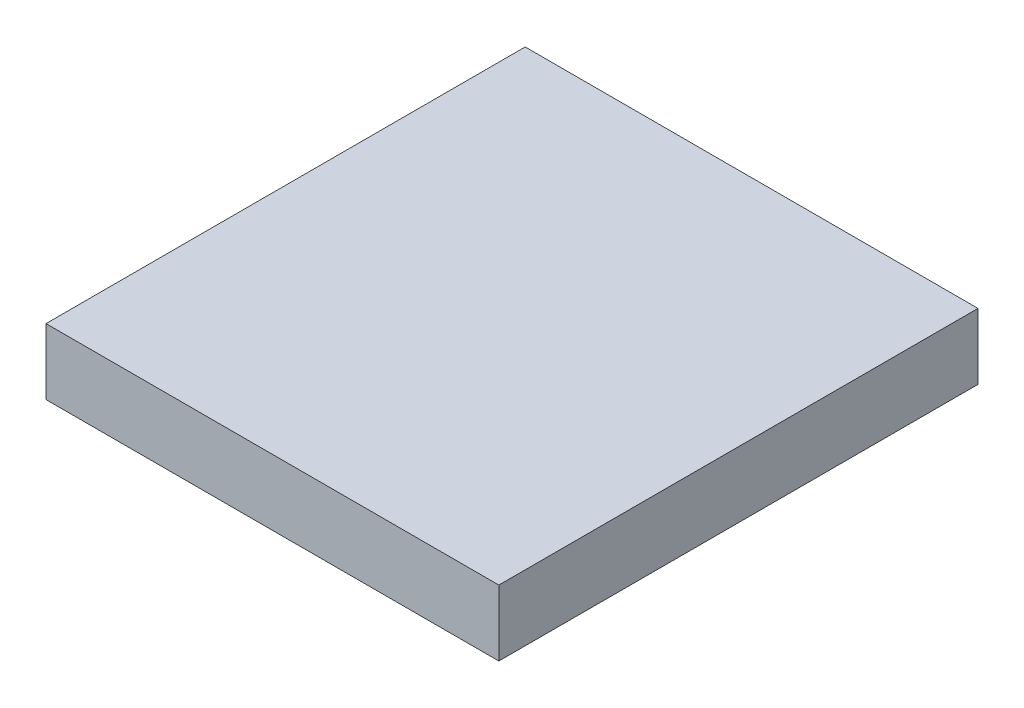
ISO-10303-21;
HEADER;
FILE_DESCRIPTION(('STEP AP214'),'2;1');
FILE_NAME('part.step','',(''),(''),'','','');
FILE_SCHEMA(('AUTOMOTIVE_DESIGN { 1 0 10303 214 1 1 1 1 }'));
ENDSEC;
DATA;
#1=APPLICATION_CONTEXT('core data for automotive mechanical design processes');
#2=APPLICATION_PROTOCOL_DEFINITION('international standard','automotive_design',2000,#1);
#3=PRODUCT_CONTEXT('',#1,'mechanical');
#4=PRODUCT('Part','Part','',(#3));
#5=PRODUCT_RELATED_PRODUCT_CATEGORY('part','',(#4));
#6=PRODUCT_DEFINITION_FORMATION('','',#4);
#7=PRODUCT_DEFINITION_CONTEXT('part definition',#1,'design');
#8=PRODUCT_DEFINITION('design','',#6,#7);
#9=PRODUCT_DEFINITION_SHAPE('','',#8);
#10=(LENGTH_UNIT() NAMED_UNIT(*) SI_UNIT(.MILLI.,.METRE.));
#11=(NAMED_UNIT(*) PLANE_ANGLE_UNIT() SI_UNIT($,.RADIAN.));
#12=(NAMED_UNIT(*) SI_UNIT($,.STERADIAN.) SOLID_ANGLE_UNIT());
#13=UNCERTAINTY_MEASURE_WITH_UNIT(LENGTH_MEASURE(1.E-05),#10,'distance_accuracy_value','');
#14=(GEOMETRIC_REPRESENTATION_CONTEXT(3) GLOBAL_UNCERTAINTY_ASSIGNED_CONTEXT((#13)) GLOBAL_UNIT_ASSIGNED_CONTEXT((#10,
#11,#12)) REPRESENTATION_CONTEXT('',''));
#15=CARTESIAN_POINT('',(0.,0.,0.));
#16=DIRECTION('',(0.,0.,1.));
#17=DIRECTION('',(1.,0.,0.));
#18=AXIS2_PLACEMENT_3D('',#15,#16,#17);
#19=CARTESIAN_POINT('',(0.,-25.,0.));
#20=DIRECTION('',(-1.,0.,0.));
#21=DIRECTION('',(0.,0.,1.));
#22=AXIS2_PLACEMENT_3D('',#19,#20,#21);
#23=PLANE('',#22);
#24=DIRECTION('',(0.,0.,1.));
#25=VECTOR('',#24,1.);
#26=CARTESIAN_POINT('',(0.,0.,0.));
#27=LINE('',#26,#25);
#28=CARTESIAN_POINT('',(0.,0.,80.));
#29=VERTEX_POINT('',#28);
#30=CARTESIAN_POINT('',(0.,0.,262.));
#31=VERTEX_POINT('',#30);
#32=EDGE_CURVE('E108',#29,#31,#27,.T.);
#33=ORIENTED_EDGE('',*,*,#32,.F.);
#34=DIRECTION('',(0.,1.,0.));
#35=VECTOR('',#34,1.);
#36=CARTESIAN_POINT('',(0.,-25.,80.));
#37=LINE('',#36,#35);
#38=CARTESIAN_POINT('',(0.,-25.,80.));
#39=VERTEX_POINT('',#38);
#40=EDGE_CURVE('E11',#39,#29,#37,.T.);
#41=ORIENTED_EDGE('',*,*,#40,.F.);
#42=DIRECTION('',(0.,0.,1.));
#43=VECTOR('',#42,1.);
#44=CARTESIAN_POINT('',(0.,-25.,0.));
#45=LINE('',#44,#43);
#46=CARTESIAN_POINT('',(0.,-25.,262.));
#47=VERTEX_POINT('',#46);
#48=EDGE_CURVE('E102',#39,#47,#45,.T.);
#49=ORIENTED_EDGE('',*,*,#48,.T.);
#50=DIRECTION('',(0.,1.,0.));
#51=VECTOR('',#50,1.);
#52=CARTESIAN_POINT('',(0.,-25.,262.));
#53=LINE('',#52,#51);
#54=EDGE_CURVE('E46',#47,#31,#53,.T.);
#55=ORIENTED_EDGE('',*,*,#54,.T.);
#56=EDGE_LOOP('',(#33,#41,#49,#55));
#57=FACE_BOUND('',#56,.T.);
#58=ADVANCED_FACE('F43',(#57),#23,.T.);
#59=CARTESIAN_POINT('',(0.,-25.,80.));
#60=DIRECTION('',(0.,0.,1.));
#61=DIRECTION('',(1.,0.,0.));
#62=AXIS2_PLACEMENT_3D('',#59,#60,#61);
#63=PLANE('',#62);
#64=DIRECTION('',(1.,0.,0.));
#65=VECTOR('',#64,1.);
#66=CARTESIAN_POINT('',(0.,0.,80.));
#67=LINE('',#66,#65);
#68=CARTESIAN_POINT('',(172.,0.,80.));
#69=VERTEX_POINT('',#68);
#70=EDGE_CURVE('E104',#29,#69,#67,.T.);
#71=ORIENTED_EDGE('',*,*,#70,.T.);
#72=DIRECTION('',(0.,1.,0.));
#73=VECTOR('',#72,1.);
#74=CARTESIAN_POINT('',(172.,-25.,80.));
#75=LINE('',#74,#73);
#76=CARTESIAN_POINT('',(172.,-25.,80.));
#77=VERTEX_POINT('',#76);
#78=EDGE_CURVE('E52',#77,#69,#75,.T.);
#79=ORIENTED_EDGE('',*,*,#78,.F.);
#80=DIRECTION('',(1.,0.,0.));
#81=VECTOR('',#80,1.);
#82=CARTESIAN_POINT('',(0.,-25.,80.));
#83=LINE('',#82,#81);
#84=EDGE_CURVE('E99',#39,#77,#83,.T.);
#85=ORIENTED_EDGE('',*,*,#84,.F.);
#86=ORIENTED_EDGE('',*,*,#40,.T.);
#87=EDGE_LOOP('',(#71,#79,#85,#86));
#88=FACE_BOUND('',#87,.T.);
#89=ADVANCED_FACE('F115',(#88),#63,.F.);
#90=CARTESIAN_POINT('',(172.,-25.,0.));
#91=DIRECTION('',(1.,0.,0.));
#92=DIRECTION('',(0.,0.,-1.));
#93=AXIS2_PLACEMENT_3D('',#90,#91,#92);
#94=PLANE('',#93);
#95=DIRECTION('',(0.,0.,-1.));
#96=VECTOR('',#95,1.);
#97=CARTESIAN_POINT('',(172.,0.,0.));
#98=LINE('',#97,#96);
#99=CARTESIAN_POINT('',(172.,0.,262.));
#100=VERTEX_POINT('',#99);
#101=EDGE_CURVE('E93',#100,#69,#98,.T.);
#102=ORIENTED_EDGE('',*,*,#101,.F.);
#103=DIRECTION('',(0.,1.,0.));
#104=VECTOR('',#103,1.);
#105=CARTESIAN_POINT('',(172.,-25.,262.));
#106=LINE('',#105,#104);
#107=CARTESIAN_POINT('',(172.,-25.,262.));
#108=VERTEX_POINT('',#107);
#109=EDGE_CURVE('E88',#108,#100,#106,.T.);
#110=ORIENTED_EDGE('',*,*,#109,.F.);
#111=DIRECTION('',(0.,0.,-1.));
#112=VECTOR('',#111,1.);
#113=CARTESIAN_POINT('',(172.,-25.,0.));
#114=LINE('',#113,#112);
#115=EDGE_CURVE('E91',#108,#77,#114,.T.);
#116=ORIENTED_EDGE('',*,*,#115,.T.);
#117=ORIENTED_EDGE('',*,*,#78,.T.);
#118=EDGE_LOOP('',(#102,#110,#116,#117));
#119=FACE_BOUND('',#118,.T.);
#120=ADVANCED_FACE('F90',(#119),#94,.T.);
#121=CARTESIAN_POINT('',(0.,-25.,262.));
#122=DIRECTION('',(0.,0.,1.));
#123=DIRECTION('',(1.,0.,0.));
#124=AXIS2_PLACEMENT_3D('',#121,#122,#123);
#125=PLANE('',#124);
#126=DIRECTION('',(1.,0.,0.));
#127=VECTOR('',#126,1.);
#128=CARTESIAN_POINT('',(0.,0.,262.));
#129=LINE('',#128,#127);
#130=EDGE_CURVE('E111',#31,#100,#129,.T.);
#131=ORIENTED_EDGE('',*,*,#130,.F.);
#132=ORIENTED_EDGE('',*,*,#54,.F.);
#133=DIRECTION('',(1.,0.,0.));
#134=VECTOR('',#133,1.);
#135=CARTESIAN_POINT('',(0.,-25.,262.));
#136=LINE('',#135,#134);
#137=EDGE_CURVE('E98',#47,#108,#136,.T.);
#138=ORIENTED_EDGE('',*,*,#137,.T.);
#139=ORIENTED_EDGE('',*,*,#109,.T.);
#140=EDGE_LOOP('',(#131,#132,#138,#139));
#141=FACE_BOUND('',#140,.T.);
#142=ADVANCED_FACE('F101',(#141),#125,.T.);
#143=CARTESIAN_POINT('',(0.,-25.,0.));
#144=DIRECTION('',(0.,1.,0.));
#145=DIRECTION('',(0.,0.,1.));
#146=AXIS2_PLACEMENT_3D('',#143,#144,#145);
#147=PLANE('',#146);
#148=ORIENTED_EDGE('',*,*,#48,.F.);
#149=ORIENTED_EDGE('',*,*,#84,.T.);
#150=ORIENTED_EDGE('',*,*,#115,.F.);
#151=ORIENTED_EDGE('',*,*,#137,.F.);
#152=EDGE_LOOP('',(#148,#149,#150,#151));
#153=FACE_BOUND('',#152,.T.);
#154=ADVANCED_FACE('F97',(#153),#147,.F.);
#155=CARTESIAN_POINT('',(0.,0.,0.));
#156=DIRECTION('',(0.,1.,0.));
#157=DIRECTION('',(0.,0.,1.));
#158=AXIS2_PLACEMENT_3D('',#155,#156,#157);
#159=PLANE('',#158);
#160=ORIENTED_EDGE('',*,*,#32,.T.);
#161=ORIENTED_EDGE('',*,*,#130,.T.);
#162=ORIENTED_EDGE('',*,*,#101,.T.);
#163=ORIENTED_EDGE('',*,*,#70,.F.);
#164=EDGE_LOOP('',(#160,#161,#162,#163));
#165=FACE_BOUND('',#164,.T.);
#166=ADVANCED_FACE('F117',(#165),#159,.T.);
#167=CLOSED_SHELL('',(#58,#89,#120,#142,#154,#166));
#168=MANIFOLD_SOLID_BREP('B2',#167);
#169=ADVANCED_BREP_SHAPE_REPRESENTATION('',(#18,#168),#14);
#170=SHAPE_DEFINITION_REPRESENTATION(#9,#169);
ENDSEC;
END-ISO-10303-21;
